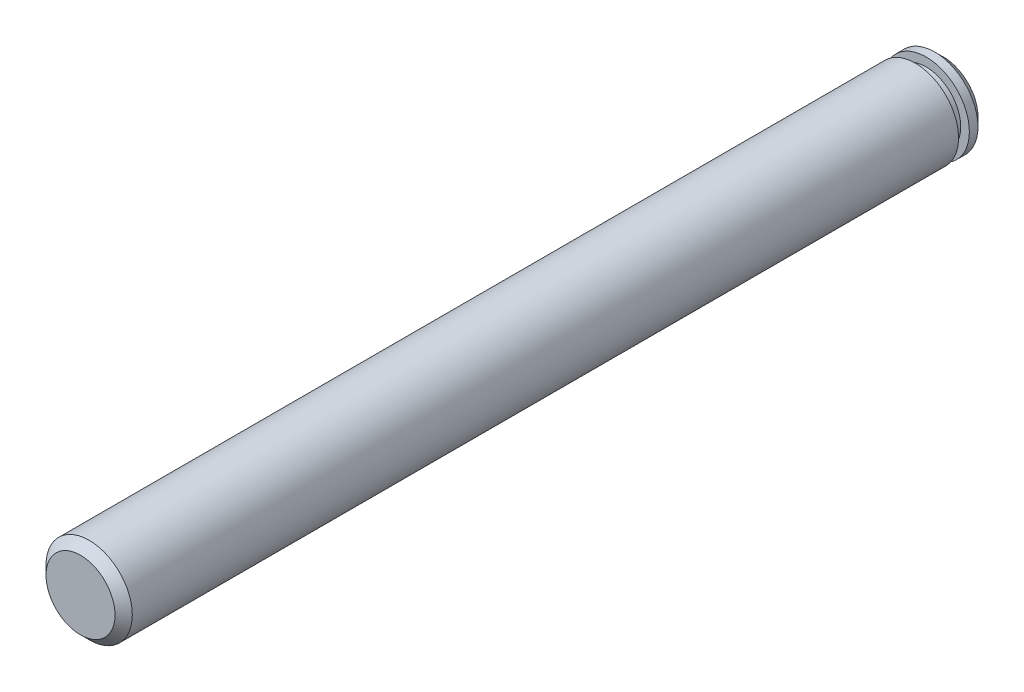
ISO-10303-21;
HEADER;
FILE_DESCRIPTION(('STEP AP214'),'2;1');
FILE_NAME('part.step','',(''),(''),'','','');
FILE_SCHEMA(('AUTOMOTIVE_DESIGN { 1 0 10303 214 1 1 1 1 }'));
ENDSEC;
DATA;
#1=APPLICATION_CONTEXT('core data for automotive mechanical design processes');
#2=APPLICATION_PROTOCOL_DEFINITION('international standard','automotive_design',2000,#1);
#3=PRODUCT_CONTEXT('',#1,'mechanical');
#4=PRODUCT('Part','Part','',(#3));
#5=PRODUCT_RELATED_PRODUCT_CATEGORY('part','',(#4));
#6=PRODUCT_DEFINITION_FORMATION('','',#4);
#7=PRODUCT_DEFINITION_CONTEXT('part definition',#1,'design');
#8=PRODUCT_DEFINITION('design','',#6,#7);
#9=PRODUCT_DEFINITION_SHAPE('','',#8);
#10=(LENGTH_UNIT() NAMED_UNIT(*) SI_UNIT(.MILLI.,.METRE.));
#11=(NAMED_UNIT(*) PLANE_ANGLE_UNIT() SI_UNIT($,.RADIAN.));
#12=(NAMED_UNIT(*) SI_UNIT($,.STERADIAN.) SOLID_ANGLE_UNIT());
#13=UNCERTAINTY_MEASURE_WITH_UNIT(LENGTH_MEASURE(1.E-05),#10,'distance_accuracy_value','');
#14=(GEOMETRIC_REPRESENTATION_CONTEXT(3) GLOBAL_UNCERTAINTY_ASSIGNED_CONTEXT((#13)) GLOBAL_UNIT_ASSIGNED_CONTEXT((#10,
#11,#12)) REPRESENTATION_CONTEXT('',''));
#15=CARTESIAN_POINT('',(0.,0.,0.));
#16=DIRECTION('',(0.,0.,1.));
#17=DIRECTION('',(1.,0.,0.));
#18=AXIS2_PLACEMENT_3D('',#15,#16,#17);
#19=CARTESIAN_POINT('',(0.,0.,127.));
#20=DIRECTION('',(0.,0.,-1.));
#21=DIRECTION('',(-1.,0.,0.));
#22=AXIS2_PLACEMENT_3D('',#19,#20,#21);
#23=CYLINDRICAL_SURFACE('',#22,6.35);
#24=CARTESIAN_POINT('',(0.,0.,125.73));
#25=DIRECTION('',(0.,0.,1.));
#26=DIRECTION('',(1.,0.,0.));
#27=AXIS2_PLACEMENT_3D('',#24,#25,#26);
#28=CIRCLE('',#27,6.35);
#29=CARTESIAN_POINT('',(6.35,0.,125.73));
#30=VERTEX_POINT('',#29);
#31=EDGE_CURVE('E60',#30,#30,#28,.F.);
#32=ORIENTED_EDGE('',*,*,#31,.T.);
#33=EDGE_LOOP('',(#32));
#34=FACE_BOUND('',#33,.T.);
#35=CARTESIAN_POINT('',(0.,0.,4.12750000000001));
#36=DIRECTION('',(0.,0.,-1.));
#37=DIRECTION('',(-1.,0.,0.));
#38=AXIS2_PLACEMENT_3D('',#35,#36,#37);
#39=CIRCLE('',#38,6.35);
#40=CARTESIAN_POINT('',(-6.35,0.,4.12750000000001));
#41=VERTEX_POINT('',#40);
#42=EDGE_CURVE('E37',#41,#41,#39,.T.);
#43=ORIENTED_EDGE('',*,*,#42,.F.);
#44=EDGE_LOOP('',(#43));
#45=FACE_BOUND('',#44,.T.);
#46=ADVANCED_FACE('F33',(#34,#45),#23,.T.);
#47=CARTESIAN_POINT('',(0.,0.,127.));
#48=DIRECTION('',(0.,0.,1.));
#49=DIRECTION('',(1.,0.,0.));
#50=AXIS2_PLACEMENT_3D('',#47,#48,#49);
#51=PLANE('',#50);
#52=CARTESIAN_POINT('',(0.,0.,127.));
#53=DIRECTION('',(0.,0.,1.));
#54=DIRECTION('',(1.,0.,0.));
#55=AXIS2_PLACEMENT_3D('',#52,#53,#54);
#56=CIRCLE('',#55,5.08000000000003);
#57=CARTESIAN_POINT('',(5.08000000000003,0.,127.));
#58=VERTEX_POINT('',#57);
#59=EDGE_CURVE('E10',#58,#58,#56,.T.);
#60=ORIENTED_EDGE('',*,*,#59,.T.);
#61=EDGE_LOOP('',(#60));
#62=FACE_BOUND('',#61,.T.);
#63=ADVANCED_FACE('F92',(#62),#51,.T.);
#64=CARTESIAN_POINT('',(0.,0.,127.));
#65=DIRECTION('',(0.,0.,-1.));
#66=DIRECTION('',(-1.,0.,0.));
#67=AXIS2_PLACEMENT_3D('',#64,#65,#66);
#68=CONICAL_SURFACE('',#67,5.08000000000003,0.785398163397439);
#69=ORIENTED_EDGE('',*,*,#31,.F.);
#70=EDGE_LOOP('',(#69));
#71=FACE_BOUND('',#70,.T.);
#72=ORIENTED_EDGE('',*,*,#59,.F.);
#73=EDGE_LOOP('',(#72));
#74=FACE_BOUND('',#73,.T.);
#75=ADVANCED_FACE('F35',(#71,#74),#68,.T.);
#76=CARTESIAN_POINT('',(5.08,0.,4.1275));
#77=DIRECTION('',(0.,0.,-1.));
#78=DIRECTION('',(-1.,0.,0.));
#79=AXIS2_PLACEMENT_3D('',#76,#77,#78);
#80=PLANE('',#79);
#81=CARTESIAN_POINT('',(0.,0.,4.1275));
#82=DIRECTION('',(0.,0.,-1.));
#83=DIRECTION('',(-1.,0.,0.));
#84=AXIS2_PLACEMENT_3D('',#81,#82,#83);
#85=CIRCLE('',#84,5.08);
#86=CARTESIAN_POINT('',(-5.08,0.,4.1275));
#87=VERTEX_POINT('',#86);
#88=EDGE_CURVE('E53',#87,#87,#85,.T.);
#89=ORIENTED_EDGE('',*,*,#88,.F.);
#90=EDGE_LOOP('',(#89));
#91=FACE_BOUND('',#90,.T.);
#92=ORIENTED_EDGE('',*,*,#42,.T.);
#93=EDGE_LOOP('',(#92));
#94=FACE_BOUND('',#93,.T.);
#95=ADVANCED_FACE('F103',(#91,#94),#80,.T.);
#96=CARTESIAN_POINT('',(5.08,0.,2.54));
#97=DIRECTION('',(0.,0.,1.));
#98=DIRECTION('',(1.,0.,0.));
#99=AXIS2_PLACEMENT_3D('',#96,#97,#98);
#100=PLANE('',#99);
#101=CARTESIAN_POINT('',(0.,0.,2.54));
#102=DIRECTION('',(0.,0.,-1.));
#103=DIRECTION('',(-1.,0.,0.));
#104=AXIS2_PLACEMENT_3D('',#101,#102,#103);
#105=CIRCLE('',#104,5.08);
#106=CARTESIAN_POINT('',(-5.08,0.,2.54));
#107=VERTEX_POINT('',#106);
#108=EDGE_CURVE('E62',#107,#107,#105,.T.);
#109=ORIENTED_EDGE('',*,*,#108,.T.);
#110=EDGE_LOOP('',(#109));
#111=FACE_BOUND('',#110,.T.);
#112=CARTESIAN_POINT('',(0.,0.,2.54));
#113=DIRECTION('',(0.,0.,1.));
#114=DIRECTION('',(1.,0.,0.));
#115=AXIS2_PLACEMENT_3D('',#112,#113,#114);
#116=CIRCLE('',#115,6.35);
#117=CARTESIAN_POINT('',(6.35,0.,2.54));
#118=VERTEX_POINT('',#117);
#119=EDGE_CURVE('E50',#118,#118,#116,.T.);
#120=ORIENTED_EDGE('',*,*,#119,.T.);
#121=EDGE_LOOP('',(#120));
#122=FACE_BOUND('',#121,.T.);
#123=ADVANCED_FACE('F102',(#111,#122),#100,.T.);
#124=CARTESIAN_POINT('',(0.,0.,0.));
#125=DIRECTION('',(0.,0.,-1.));
#126=DIRECTION('',(-1.,0.,0.));
#127=AXIS2_PLACEMENT_3D('',#124,#125,#126);
#128=CYLINDRICAL_SURFACE('',#127,5.08);
#129=ORIENTED_EDGE('',*,*,#88,.T.);
#130=EDGE_LOOP('',(#129));
#131=FACE_BOUND('',#130,.T.);
#132=ORIENTED_EDGE('',*,*,#108,.F.);
#133=EDGE_LOOP('',(#132));
#134=FACE_BOUND('',#133,.T.);
#135=ADVANCED_FACE('F87',(#131,#134),#128,.T.);
#136=CARTESIAN_POINT('',(0.,0.,0.));
#137=DIRECTION('',(0.,0.,1.));
#138=DIRECTION('',(1.,0.,0.));
#139=AXIS2_PLACEMENT_3D('',#136,#137,#138);
#140=PLANE('',#139);
#141=CARTESIAN_POINT('',(0.,0.,0.));
#142=DIRECTION('',(0.,0.,1.));
#143=DIRECTION('',(1.,0.,0.));
#144=AXIS2_PLACEMENT_3D('',#141,#142,#143);
#145=CIRCLE('',#144,5.08);
#146=CARTESIAN_POINT('',(5.08,0.,0.));
#147=VERTEX_POINT('',#146);
#148=EDGE_CURVE('E41',#147,#147,#145,.F.);
#149=ORIENTED_EDGE('',*,*,#148,.T.);
#150=EDGE_LOOP('',(#149));
#151=FACE_BOUND('',#150,.T.);
#152=ADVANCED_FACE('F80',(#151),#140,.F.);
#153=CARTESIAN_POINT('',(0.,0.,1.26999999999997));
#154=DIRECTION('',(0.,0.,1.));
#155=DIRECTION('',(1.,0.,0.));
#156=AXIS2_PLACEMENT_3D('',#153,#154,#155);
#157=CONICAL_SURFACE('',#156,6.35,0.785398163397461);
#158=CARTESIAN_POINT('',(0.,0.,1.26999999999997));
#159=DIRECTION('',(0.,0.,1.));
#160=DIRECTION('',(1.,0.,0.));
#161=AXIS2_PLACEMENT_3D('',#158,#159,#160);
#162=CIRCLE('',#161,6.35);
#163=CARTESIAN_POINT('',(6.35,0.,1.26999999999997));
#164=VERTEX_POINT('',#163);
#165=EDGE_CURVE('E47',#164,#164,#162,.T.);
#166=CARTESIAN_POINT('',(5.08,0.,0.));
#167=CARTESIAN_POINT('',(5.09322916666667,0.,0.0132291666666663));
#168=CARTESIAN_POINT('',(5.10645833333333,0.,0.0264583333333325));
#169=CARTESIAN_POINT('',(5.13291666666667,0.,0.052916666666665));
#170=CARTESIAN_POINT('',(5.14614583333334,0.,0.0661458333333313));
#171=CARTESIAN_POINT('',(5.17260416666667,0.,0.0926041666666639));
#172=CARTESIAN_POINT('',(5.18583333333333,0.,0.10583333333333));
#173=CARTESIAN_POINT('',(5.21229166666667,0.,0.132291666666663));
#174=CARTESIAN_POINT('',(5.22552083333333,0.,0.145520833333329));
#175=CARTESIAN_POINT('',(5.25197916666667,0.,0.171979166666662));
#176=CARTESIAN_POINT('',(5.26520833333333,0.,0.185208333333328));
#177=CARTESIAN_POINT('',(5.29166666666667,0.,0.211666666666661));
#178=CARTESIAN_POINT('',(5.30489583333333,0.,0.224895833333327));
#179=CARTESIAN_POINT('',(5.33135416666667,0.,0.25135416666666));
#180=CARTESIAN_POINT('',(5.34458333333334,0.,0.264583333333326));
#181=CARTESIAN_POINT('',(5.37104166666667,0.,0.291041666666659));
#182=CARTESIAN_POINT('',(5.38427083333333,0.,0.304270833333325));
#183=CARTESIAN_POINT('',(5.41072916666667,0.,0.330729166666658));
#184=CARTESIAN_POINT('',(5.42395833333333,0.,0.343958333333324));
#185=CARTESIAN_POINT('',(5.45041666666667,0.,0.370416666666656));
#186=CARTESIAN_POINT('',(5.46364583333333,0.,0.383645833333323));
#187=CARTESIAN_POINT('',(5.49010416666667,0.,0.410104166666655));
#188=CARTESIAN_POINT('',(5.50333333333333,0.,0.423333333333322));
#189=CARTESIAN_POINT('',(5.52979166666667,0.,0.449791666666654));
#190=CARTESIAN_POINT('',(5.54302083333334,0.,0.463020833333321));
#191=CARTESIAN_POINT('',(5.56947916666667,0.,0.489479166666653));
#192=CARTESIAN_POINT('',(5.58270833333333,0.,0.50270833333332));
#193=CARTESIAN_POINT('',(5.60916666666667,0.,0.529166666666652));
#194=CARTESIAN_POINT('',(5.62239583333333,0.,0.542395833333319));
#195=CARTESIAN_POINT('',(5.64885416666667,0.,0.568854166666651));
#196=CARTESIAN_POINT('',(5.66208333333333,0.,0.582083333333318));
#197=CARTESIAN_POINT('',(5.68854166666667,0.,0.60854166666665));
#198=CARTESIAN_POINT('',(5.70177083333333,0.,0.621770833333316));
#199=CARTESIAN_POINT('',(5.72822916666667,0.,0.648229166666649));
#200=CARTESIAN_POINT('',(5.74145833333333,0.,0.661458333333315));
#201=CARTESIAN_POINT('',(5.76791666666667,0.,0.687916666666648));
#202=CARTESIAN_POINT('',(5.78114583333333,0.,0.701145833333314));
#203=CARTESIAN_POINT('',(5.80760416666667,0.,0.727604166666647));
#204=CARTESIAN_POINT('',(5.82083333333333,0.,0.740833333333313));
#205=CARTESIAN_POINT('',(5.84729166666667,0.,0.767291666666646));
#206=CARTESIAN_POINT('',(5.86052083333333,0.,0.780520833333312));
#207=CARTESIAN_POINT('',(5.88697916666667,0.,0.806979166666645));
#208=CARTESIAN_POINT('',(5.90020833333333,0.,0.820208333333311));
#209=CARTESIAN_POINT('',(5.92666666666667,0.,0.846666666666644));
#210=CARTESIAN_POINT('',(5.93989583333333,0.,0.85989583333331));
#211=CARTESIAN_POINT('',(5.96635416666667,0.,0.886354166666643));
#212=CARTESIAN_POINT('',(5.97958333333333,0.,0.899583333333309));
#213=CARTESIAN_POINT('',(6.00604166666667,0.,0.926041666666642));
#214=CARTESIAN_POINT('',(6.01927083333333,0.,0.939270833333308));
#215=CARTESIAN_POINT('',(6.04572916666667,0.,0.96572916666664));
#216=CARTESIAN_POINT('',(6.05895833333333,0.,0.978958333333307));
#217=CARTESIAN_POINT('',(6.08541666666667,0.,1.00541666666664));
#218=CARTESIAN_POINT('',(6.09864583333333,0.,1.01864583333331));
#219=CARTESIAN_POINT('',(6.12510416666667,0.,1.04510416666664));
#220=CARTESIAN_POINT('',(6.13833333333333,0.,1.0583333333333));
#221=CARTESIAN_POINT('',(6.16479166666667,0.,1.08479166666664));
#222=CARTESIAN_POINT('',(6.17802083333333,0.,1.0980208333333));
#223=CARTESIAN_POINT('',(6.20447916666667,0.,1.12447916666664));
#224=CARTESIAN_POINT('',(6.21770833333333,0.,1.1377083333333));
#225=CARTESIAN_POINT('',(6.24416666666667,0.,1.16416666666664));
#226=CARTESIAN_POINT('',(6.25739583333333,0.,1.1773958333333));
#227=CARTESIAN_POINT('',(6.28385416666667,0.,1.20385416666663));
#228=CARTESIAN_POINT('',(6.29708333333333,0.,1.2170833333333));
#229=CARTESIAN_POINT('',(6.32354166666667,0.,1.24354166666663));
#230=CARTESIAN_POINT('',(6.33677083333333,0.,1.2567708333333));
#231=CARTESIAN_POINT('',(6.35,0.,1.26999999999997));
#232=B_SPLINE_CURVE_WITH_KNOTS('',3,(#166,#167,#168,#169,#170,#171,#172,#173,#174,#175,#176,
#177,#178,#179,#180,#181,#182,#183,#184,#185,#186,#187,#188,#189,#190,#191,#192,#193,#194,#195,
#196,#197,#198,#199,#200,#201,#202,#203,#204,#205,#206,#207,#208,#209,#210,#211,#212,#213,#214,
#215,#216,#217,#218,#219,#220,#221,#222,#223,#224,#225,#226,#227,#228,#229,#230,#231),
.UNSPECIFIED.,.F.,.F.,(4,2,2,2,2,2,2,2,2,2,2,2,2,2,2,2,2,2,2,2,2,2,2,2,2,2,2,2,2,2,2,2,4),(0.,
0.0561266007566813,0.112253201513363,0.168379802270045,0.224506403026726,0.280633003783407,
0.336759604540089,0.39288620529677,0.449012806053452,0.505139406810133,0.561266007566814,
0.617392608323496,0.673519209080177,0.729645809836859,0.78577241059354,0.841899011350221,
0.898025612106902,0.954152212863584,1.01027881362027,1.06640541437695,1.12253201513363,
1.17865861589031,1.23478521664699,1.29091181740367,1.34703841816035,1.40316501891704,
1.45929161967372,1.5154182204304,1.57154482118708,1.62767142194376,1.68379802270044,
1.73992462345712,1.7960512242138),.UNSPECIFIED.);
#233=EDGE_CURVE('BSEAM78',#147,#164,#232,.T.);
#234=ORIENTED_EDGE('',*,*,#148,.F.);
#235=ORIENTED_EDGE('',*,*,#165,.F.);
#236=ORIENTED_EDGE('',*,*,#233,.T.);
#237=ORIENTED_EDGE('',*,*,#233,.F.);
#238=EDGE_LOOP('',(#234,#236,#235,#237));
#239=FACE_BOUND('',#238,.T.);
#240=ADVANCED_FACE('F78',(#239),#157,.T.);
#241=ORIENTED_EDGE('',*,*,#165,.T.);
#242=EDGE_LOOP('',(#241));
#243=FACE_BOUND('',#242,.T.);
#244=ORIENTED_EDGE('',*,*,#119,.F.);
#245=EDGE_LOOP('',(#244));
#246=FACE_BOUND('',#245,.T.);
#247=ADVANCED_FACE('F75',(#243,#246),#23,.T.);
#248=CLOSED_SHELL('',(#46,#63,#75,#95,#123,#135,#152,#240,#247));
#249=MANIFOLD_SOLID_BREP('B2',#248);
#250=ADVANCED_BREP_SHAPE_REPRESENTATION('',(#18,#249),#14);
#251=SHAPE_DEFINITION_REPRESENTATION(#9,#250);
ENDSEC;
END-ISO-10303-21;
